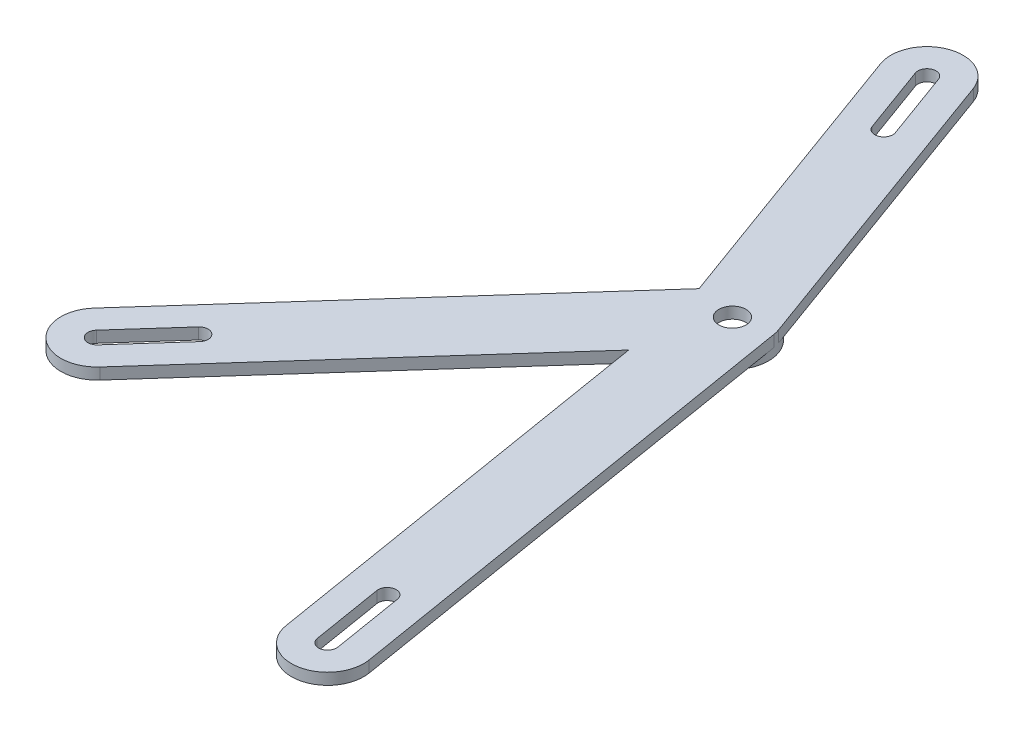
ISO-10303-21;
HEADER;
FILE_DESCRIPTION(('STEP AP214'),'2;1');
FILE_NAME('part.step','',(''),(''),'','','');
FILE_SCHEMA(('AUTOMOTIVE_DESIGN { 1 0 10303 214 1 1 1 1 }'));
ENDSEC;
DATA;
#1=APPLICATION_CONTEXT('core data for automotive mechanical design processes');
#2=APPLICATION_PROTOCOL_DEFINITION('international standard','automotive_design',2000,#1);
#3=PRODUCT_CONTEXT('',#1,'mechanical');
#4=PRODUCT('Part','Part','',(#3));
#5=PRODUCT_RELATED_PRODUCT_CATEGORY('part','',(#4));
#6=PRODUCT_DEFINITION_FORMATION('','',#4);
#7=PRODUCT_DEFINITION_CONTEXT('part definition',#1,'design');
#8=PRODUCT_DEFINITION('design','',#6,#7);
#9=PRODUCT_DEFINITION_SHAPE('','',#8);
#10=(LENGTH_UNIT() NAMED_UNIT(*) SI_UNIT(.MILLI.,.METRE.));
#11=(NAMED_UNIT(*) PLANE_ANGLE_UNIT() SI_UNIT($,.RADIAN.));
#12=(NAMED_UNIT(*) SI_UNIT($,.STERADIAN.) SOLID_ANGLE_UNIT());
#13=UNCERTAINTY_MEASURE_WITH_UNIT(LENGTH_MEASURE(1.E-05),#10,'distance_accuracy_value','');
#14=(GEOMETRIC_REPRESENTATION_CONTEXT(3) GLOBAL_UNCERTAINTY_ASSIGNED_CONTEXT((#13)) GLOBAL_UNIT_ASSIGNED_CONTEXT((#10,
#11,#12)) REPRESENTATION_CONTEXT('',''));
#15=CARTESIAN_POINT('',(0.,0.,0.));
#16=DIRECTION('',(0.,0.,1.));
#17=DIRECTION('',(1.,0.,0.));
#18=AXIS2_PLACEMENT_3D('',#15,#16,#17);
#19=CARTESIAN_POINT('',(-133.280183157734,-3.,164.123164888468));
#20=DIRECTION('',(0.,1.,0.));
#21=DIRECTION('',(0.,0.,1.));
#22=AXIS2_PLACEMENT_3D('',#19,#20,#21);
#23=CYLINDRICAL_SURFACE('',#22,3.175);
#24=DIRECTION('',(0.,1.,0.));
#25=VECTOR('',#24,1.);
#26=CARTESIAN_POINT('',(-135.646330605221,-3.,162.006098225193));
#27=LINE('',#26,#25);
#28=CARTESIAN_POINT('',(-135.646330605221,4.,162.006098225193));
#29=VERTEX_POINT('',#28);
#30=CARTESIAN_POINT('',(-135.646330605221,0.,162.006098225193));
#31=VERTEX_POINT('',#30);
#32=EDGE_CURVE('E383',#29,#31,#27,.F.);
#33=ORIENTED_EDGE('',*,*,#32,.F.);
#34=CARTESIAN_POINT('',(-133.280183157734,4.,164.123164888468));
#35=DIRECTION('',(0.,1.,0.));
#36=DIRECTION('',(0.,0.,1.));
#37=AXIS2_PLACEMENT_3D('',#34,#35,#36);
#38=CIRCLE('',#37,3.175);
#39=CARTESIAN_POINT('',(-130.914035710247,4.,166.240231551743));
#40=VERTEX_POINT('',#39);
#41=EDGE_CURVE('E235',#29,#40,#38,.T.);
#42=ORIENTED_EDGE('',*,*,#41,.T.);
#43=DIRECTION('',(0.,1.,0.));
#44=VECTOR('',#43,1.);
#45=CARTESIAN_POINT('',(-130.914035710247,-3.,166.240231551743));
#46=LINE('',#45,#44);
#47=CARTESIAN_POINT('',(-130.914035710247,0.,166.240231551743));
#48=VERTEX_POINT('',#47);
#49=EDGE_CURVE('E380',#40,#48,#46,.F.);
#50=ORIENTED_EDGE('',*,*,#49,.T.);
#51=CARTESIAN_POINT('',(-133.280183157734,0.,164.123164888468));
#52=DIRECTION('',(0.,1.,0.));
#53=DIRECTION('',(0.,0.,1.));
#54=AXIS2_PLACEMENT_3D('',#51,#52,#53);
#55=CIRCLE('',#54,3.175);
#56=EDGE_CURVE('E226',#31,#48,#55,.T.);
#57=ORIENTED_EDGE('',*,*,#56,.F.);
#58=EDGE_LOOP('',(#33,#42,#50,#57));
#59=FACE_BOUND('',#58,.T.);
#60=ADVANCED_FACE('F44',(#59),#23,.F.);
#61=CARTESIAN_POINT('',(0.159159837328364,-3.,216.518806919335));
#62=DIRECTION('',(0.,1.,0.));
#63=DIRECTION('',(0.,0.,1.));
#64=AXIS2_PLACEMENT_3D('',#61,#62,#63);
#65=CYLINDRICAL_SURFACE('',#64,3.175);
#66=DIRECTION('',(0.,1.,0.));
#67=VECTOR('',#66,1.);
#68=CARTESIAN_POINT('',(-2.97383797836201,-3.,217.033539555642));
#69=LINE('',#68,#67);
#70=CARTESIAN_POINT('',(-2.97383797836201,4.,217.033539555642));
#71=VERTEX_POINT('',#70);
#72=CARTESIAN_POINT('',(-2.97383797836201,0.,217.033539555642));
#73=VERTEX_POINT('',#72);
#74=EDGE_CURVE('E377',#71,#73,#69,.F.);
#75=ORIENTED_EDGE('',*,*,#74,.F.);
#76=CARTESIAN_POINT('',(0.159159837328364,4.,216.518806919335));
#77=DIRECTION('',(0.,1.,0.));
#78=DIRECTION('',(0.,0.,1.));
#79=AXIS2_PLACEMENT_3D('',#76,#77,#78);
#80=CIRCLE('',#79,3.175);
#81=CARTESIAN_POINT('',(3.29215765301874,4.,216.004074283028));
#82=VERTEX_POINT('',#81);
#83=EDGE_CURVE('E227',#71,#82,#80,.T.);
#84=ORIENTED_EDGE('',*,*,#83,.T.);
#85=DIRECTION('',(0.,1.,0.));
#86=VECTOR('',#85,1.);
#87=CARTESIAN_POINT('',(3.29215765301874,-3.,216.004074283028));
#88=LINE('',#87,#86);
#89=CARTESIAN_POINT('',(3.29215765301874,0.,216.004074283028));
#90=VERTEX_POINT('',#89);
#91=EDGE_CURVE('E374',#82,#90,#88,.F.);
#92=ORIENTED_EDGE('',*,*,#91,.T.);
#93=CARTESIAN_POINT('',(0.159159837328364,0.,216.518806919335));
#94=DIRECTION('',(0.,1.,0.));
#95=DIRECTION('',(0.,0.,1.));
#96=AXIS2_PLACEMENT_3D('',#93,#94,#95);
#97=CIRCLE('',#96,3.175);
#98=EDGE_CURVE('E232',#73,#90,#97,.T.);
#99=ORIENTED_EDGE('',*,*,#98,.F.);
#100=EDGE_LOOP('',(#75,#84,#92,#99));
#101=FACE_BOUND('',#100,.T.);
#102=ADVANCED_FACE('F485',(#101),#65,.F.);
#103=CARTESIAN_POINT('',(-67.0106447263582,-3.,-61.3225533952196));
#104=DIRECTION('',(0.,1.,0.));
#105=DIRECTION('',(0.,0.,1.));
#106=AXIS2_PLACEMENT_3D('',#103,#104,#105);
#107=CYLINDRICAL_SURFACE('',#106,3.175);
#108=DIRECTION('',(0.,1.,0.));
#109=VECTOR('',#108,1.);
#110=CARTESIAN_POINT('',(-64.0274998926001,-3.,-62.4095087304667));
#111=LINE('',#110,#109);
#112=CARTESIAN_POINT('',(-64.0274998926001,4.,-62.4095087304667));
#113=VERTEX_POINT('',#112);
#114=CARTESIAN_POINT('',(-64.0274998926001,0.,-62.4095087304667));
#115=VERTEX_POINT('',#114);
#116=EDGE_CURVE('E209',#113,#115,#111,.F.);
#117=ORIENTED_EDGE('',*,*,#116,.F.);
#118=CARTESIAN_POINT('',(-67.0106447263582,4.,-61.3225533952196));
#119=DIRECTION('',(0.,1.,0.));
#120=DIRECTION('',(0.,0.,1.));
#121=AXIS2_PLACEMENT_3D('',#118,#119,#120);
#122=CIRCLE('',#121,3.175);
#123=CARTESIAN_POINT('',(-69.9937895601164,4.,-60.2355980599725));
#124=VERTEX_POINT('',#123);
#125=EDGE_CURVE('E217',#113,#124,#122,.T.);
#126=ORIENTED_EDGE('',*,*,#125,.T.);
#127=DIRECTION('',(0.,1.,0.));
#128=VECTOR('',#127,1.);
#129=CARTESIAN_POINT('',(-69.9937895601164,-3.,-60.2355980599725));
#130=LINE('',#129,#128);
#131=CARTESIAN_POINT('',(-69.9937895601164,0.,-60.2355980599725));
#132=VERTEX_POINT('',#131);
#133=EDGE_CURVE('E196',#124,#132,#130,.F.);
#134=ORIENTED_EDGE('',*,*,#133,.T.);
#135=CARTESIAN_POINT('',(-67.0106447263582,0.,-61.3225533952196));
#136=DIRECTION('',(0.,1.,0.));
#137=DIRECTION('',(0.,0.,1.));
#138=AXIS2_PLACEMENT_3D('',#135,#136,#137);
#139=CIRCLE('',#138,3.175);
#140=EDGE_CURVE('E253',#115,#132,#139,.T.);
#141=ORIENTED_EDGE('',*,*,#140,.F.);
#142=EDGE_LOOP('',(#117,#126,#134,#141));
#143=FACE_BOUND('',#142,.T.);
#144=ADVANCED_FACE('F224',(#143),#107,.F.);
#145=CARTESIAN_POINT('',(-27.8150353373511,-3.,46.2496493100997));
#146=DIRECTION('',(0.,1.,0.));
#147=DIRECTION('',(0.,0.,1.));
#148=AXIS2_PLACEMENT_3D('',#145,#146,#147);
#149=CYLINDRICAL_SURFACE('',#148,4.7625);
#150=CARTESIAN_POINT('',(-27.8150353373511,4.,46.2496493100997));
#151=DIRECTION('',(0.,1.,0.));
#152=DIRECTION('',(0.,0.,1.));
#153=AXIS2_PLACEMENT_3D('',#150,#151,#152);
#154=CIRCLE('',#153,4.7625);
#155=CARTESIAN_POINT('',(-27.8150353373511,4.,51.0121493100997));
#156=VERTEX_POINT('',#155);
#157=EDGE_CURVE('E254',#156,#156,#154,.T.);
#158=ORIENTED_EDGE('',*,*,#157,.T.);
#159=EDGE_LOOP('',(#158));
#160=FACE_BOUND('',#159,.T.);
#161=CARTESIAN_POINT('',(-27.8150353373511,0.,46.2496493100997));
#162=DIRECTION('',(0.,-1.,0.));
#163=DIRECTION('',(0.,0.,-1.));
#164=AXIS2_PLACEMENT_3D('',#161,#162,#163);
#165=CIRCLE('',#164,4.7625);
#166=CARTESIAN_POINT('',(-27.8150353373511,0.,41.4871493100997));
#167=VERTEX_POINT('',#166);
#168=EDGE_CURVE('E248',#167,#167,#165,.F.);
#169=ORIENTED_EDGE('',*,*,#168,.F.);
#170=EDGE_LOOP('',(#169));
#171=FACE_BOUND('',#170,.T.);
#172=ADVANCED_FACE('F492',(#160,#171),#149,.F.);
#173=CARTESIAN_POINT('',(-67.0106447263582,4.,-61.3225533952196));
#174=DIRECTION('',(0.,-1.,0.));
#175=DIRECTION('',(0.,0.,-1.));
#176=AXIS2_PLACEMENT_3D('',#173,#174,#175);
#177=CYLINDRICAL_SURFACE('',#176,12.7);
#178=CARTESIAN_POINT('',(-67.0106447263582,0.,-61.3225533952196));
#179=DIRECTION('',(0.,1.,0.));
#180=DIRECTION('',(0.,0.,1.));
#181=AXIS2_PLACEMENT_3D('',#178,#179,#180);
#182=CIRCLE('',#181,12.7);
#183=CARTESIAN_POINT('',(-55.0780653913257,0.,-65.6703747362081));
#184=VERTEX_POINT('',#183);
#185=CARTESIAN_POINT('',(-78.9432240613906,0.,-56.9747320542308));
#186=VERTEX_POINT('',#185);
#187=EDGE_CURVE('E262',#184,#186,#182,.T.);
#188=ORIENTED_EDGE('',*,*,#187,.T.);
#189=DIRECTION('',(0.,-1.,0.));
#190=VECTOR('',#189,1.);
#191=CARTESIAN_POINT('',(-78.9432240613906,4.,-56.9747320542308));
#192=LINE('',#191,#190);
#193=CARTESIAN_POINT('',(-78.9432240613906,4.,-56.9747320542308));
#194=VERTEX_POINT('',#193);
#195=EDGE_CURVE('E358',#194,#186,#192,.T.);
#196=ORIENTED_EDGE('',*,*,#195,.F.);
#197=CARTESIAN_POINT('',(-67.0106447263582,4.,-61.3225533952196));
#198=DIRECTION('',(0.,1.,0.));
#199=DIRECTION('',(0.,0.,1.));
#200=AXIS2_PLACEMENT_3D('',#197,#198,#199);
#201=CIRCLE('',#200,12.7);
#202=CARTESIAN_POINT('',(-55.0780653913257,4.,-65.6703747362081));
#203=VERTEX_POINT('',#202);
#204=EDGE_CURVE('E263',#203,#194,#201,.T.);
#205=ORIENTED_EDGE('',*,*,#204,.F.);
#206=DIRECTION('',(0.,-1.,0.));
#207=VECTOR('',#206,1.);
#208=CARTESIAN_POINT('',(-55.0780653913257,4.,-65.6703747362081));
#209=LINE('',#208,#207);
#210=EDGE_CURVE('E295',#203,#184,#209,.T.);
#211=ORIENTED_EDGE('',*,*,#210,.T.);
#212=EDGE_LOOP('',(#188,#196,#205,#211));
#213=FACE_BOUND('',#212,.T.);
#214=ADVANCED_FACE('F46',(#213),#177,.T.);
#215=CARTESIAN_POINT('',(-78.9432240613906,4.,-56.9747320542308));
#216=DIRECTION('',(0.939573175986812,0.,-0.342348137085708));
#217=DIRECTION('',(-0.342348137085708,0.,-0.939573175986812));
#218=AXIS2_PLACEMENT_3D('',#215,#216,#217);
#219=PLANE('',#218);
#220=DIRECTION('',(0.342348137085708,0.,0.939573175986812));
#221=VECTOR('',#220,1.);
#222=CARTESIAN_POINT('',(-78.9432240613906,0.,-56.9747320542308));
#223=LINE('',#222,#221);
#224=CARTESIAN_POINT('',(-42.3517937842619,0.,43.4503108627536));
#225=VERTEX_POINT('',#224);
#226=EDGE_CURVE('E299',#186,#225,#223,.T.);
#227=ORIENTED_EDGE('',*,*,#226,.T.);
#228=DIRECTION('',(0.,-1.,0.));
#229=VECTOR('',#228,1.);
#230=CARTESIAN_POINT('',(-42.3517937842619,4.,43.4503108627536));
#231=LINE('',#230,#229);
#232=CARTESIAN_POINT('',(-42.3517937842619,4.,43.4503108627536));
#233=VERTEX_POINT('',#232);
#234=EDGE_CURVE('E354',#233,#225,#231,.T.);
#235=ORIENTED_EDGE('',*,*,#234,.F.);
#236=DIRECTION('',(0.342348137085708,0.,0.939573175986812));
#237=VECTOR('',#236,1.);
#238=CARTESIAN_POINT('',(-78.9432240613906,4.,-56.9747320542308));
#239=LINE('',#238,#237);
#240=EDGE_CURVE('E267',#194,#233,#239,.T.);
#241=ORIENTED_EDGE('',*,*,#240,.F.);
#242=ORIENTED_EDGE('',*,*,#195,.T.);
#243=EDGE_LOOP('',(#227,#235,#241,#242));
#244=FACE_BOUND('',#243,.T.);
#245=ADVANCED_FACE('F544',(#244),#219,.F.);
#246=CARTESIAN_POINT('',(-42.3517937842619,4.,43.4503108627536));
#247=DIRECTION('',(0.745243290547027,0.,0.666792649850491));
#248=DIRECTION('',(0.666792649850491,0.,-0.745243290547027));
#249=AXIS2_PLACEMENT_3D('',#246,#247,#248);
#250=PLANE('',#249);
#251=DIRECTION('',(-0.666792649850491,0.,0.745243290547027));
#252=VECTOR('',#251,1.);
#253=CARTESIAN_POINT('',(-42.3517937842619,0.,43.4503108627536));
#254=LINE('',#253,#252);
#255=CARTESIAN_POINT('',(-142.744772947681,0.,155.654898235367));
#256=VERTEX_POINT('',#255);
#257=EDGE_CURVE('E302',#225,#256,#254,.T.);
#258=ORIENTED_EDGE('',*,*,#257,.T.);
#259=DIRECTION('',(0.,-1.,0.));
#260=VECTOR('',#259,1.);
#261=CARTESIAN_POINT('',(-142.744772947681,4.,155.654898235367));
#262=LINE('',#261,#260);
#263=CARTESIAN_POINT('',(-142.744772947681,4.,155.654898235367));
#264=VERTEX_POINT('',#263);
#265=EDGE_CURVE('E350',#264,#256,#262,.T.);
#266=ORIENTED_EDGE('',*,*,#265,.F.);
#267=DIRECTION('',(-0.666792649850491,0.,0.745243290547027));
#268=VECTOR('',#267,1.);
#269=CARTESIAN_POINT('',(-42.3517937842619,4.,43.4503108627536));
#270=LINE('',#269,#268);
#271=EDGE_CURVE('E271',#233,#264,#270,.T.);
#272=ORIENTED_EDGE('',*,*,#271,.F.);
#273=ORIENTED_EDGE('',*,*,#234,.T.);
#274=EDGE_LOOP('',(#258,#266,#272,#273));
#275=FACE_BOUND('',#274,.T.);
#276=ADVANCED_FACE('F541',(#275),#250,.F.);
#277=CARTESIAN_POINT('',(-133.280183157734,4.,164.123164888468));
#278=DIRECTION('',(0.,-1.,0.));
#279=DIRECTION('',(0.,0.,-1.));
#280=AXIS2_PLACEMENT_3D('',#277,#278,#279);
#281=CYLINDRICAL_SURFACE('',#280,12.7);
#282=CARTESIAN_POINT('',(-133.280183157734,0.,164.123164888468));
#283=DIRECTION('',(0.,1.,0.));
#284=DIRECTION('',(0.,0.,1.));
#285=AXIS2_PLACEMENT_3D('',#282,#283,#284);
#286=CIRCLE('',#285,12.7);
#287=CARTESIAN_POINT('',(-123.815593367787,0.,172.591431541569));
#288=VERTEX_POINT('',#287);
#289=EDGE_CURVE('E305',#256,#288,#286,.T.);
#290=ORIENTED_EDGE('',*,*,#289,.T.);
#291=DIRECTION('',(0.,-1.,0.));
#292=VECTOR('',#291,1.);
#293=CARTESIAN_POINT('',(-123.815593367787,4.,172.591431541569));
#294=LINE('',#293,#292);
#295=CARTESIAN_POINT('',(-123.815593367787,4.,172.591431541569));
#296=VERTEX_POINT('',#295);
#297=EDGE_CURVE('E346',#296,#288,#294,.T.);
#298=ORIENTED_EDGE('',*,*,#297,.F.);
#299=CARTESIAN_POINT('',(-133.280183157734,4.,164.123164888468));
#300=DIRECTION('',(0.,1.,0.));
#301=DIRECTION('',(0.,0.,1.));
#302=AXIS2_PLACEMENT_3D('',#299,#300,#301);
#303=CIRCLE('',#302,12.7);
#304=EDGE_CURVE('E274',#264,#296,#303,.T.);
#305=ORIENTED_EDGE('',*,*,#304,.F.);
#306=ORIENTED_EDGE('',*,*,#265,.T.);
#307=EDGE_LOOP('',(#290,#298,#305,#306));
#308=FACE_BOUND('',#307,.T.);
#309=ADVANCED_FACE('F537',(#308),#281,.T.);
#310=CARTESIAN_POINT('',(-36.0448907355709,4.,74.4941785830614));
#311=DIRECTION('',(-0.745243290547029,0.,-0.666792649850489));
#312=DIRECTION('',(-0.666792649850489,0.,0.745243290547029));
#313=AXIS2_PLACEMENT_3D('',#310,#311,#312);
#314=PLANE('',#313);
#315=DIRECTION('',(0.666792649850489,0.,-0.745243290547029));
#316=VECTOR('',#315,1.);
#317=CARTESIAN_POINT('',(-36.0448907355709,0.,74.4941785830614));
#318=LINE('',#317,#316);
#319=CARTESIAN_POINT('',(-36.0448907355709,0.,74.4941785830614));
#320=VERTEX_POINT('',#319);
#321=EDGE_CURVE('E308',#288,#320,#318,.T.);
#322=ORIENTED_EDGE('',*,*,#321,.T.);
#323=DIRECTION('',(0.,-1.,0.));
#324=VECTOR('',#323,1.);
#325=CARTESIAN_POINT('',(-36.0448907355709,4.,74.4941785830614));
#326=LINE('',#325,#324);
#327=CARTESIAN_POINT('',(-36.0448907355709,4.,74.4941785830614));
#328=VERTEX_POINT('',#327);
#329=EDGE_CURVE('E342',#328,#320,#326,.T.);
#330=ORIENTED_EDGE('',*,*,#329,.F.);
#331=DIRECTION('',(0.666792649850489,0.,-0.745243290547029));
#332=VECTOR('',#331,1.);
#333=CARTESIAN_POINT('',(-36.0448907355709,4.,74.4941785830614));
#334=LINE('',#333,#332);
#335=EDGE_CURVE('E277',#296,#328,#334,.T.);
#336=ORIENTED_EDGE('',*,*,#335,.F.);
#337=ORIENTED_EDGE('',*,*,#297,.T.);
#338=EDGE_LOOP('',(#322,#330,#336,#337));
#339=FACE_BOUND('',#338,.T.);
#340=ADVANCED_FACE('F533',(#339),#314,.F.);
#341=CARTESIAN_POINT('',(-36.0448907355709,4.,74.4941785830614));
#342=DIRECTION('',(0.986770965571771,0.,-0.162120515372221));
#343=DIRECTION('',(-0.162120515372221,0.,-0.986770965571771));
#344=AXIS2_PLACEMENT_3D('',#341,#342,#343);
#345=PLANE('',#344);
#346=DIRECTION('',(0.162120515372221,0.,0.986770965571771));
#347=VECTOR('',#346,1.);
#348=CARTESIAN_POINT('',(-36.0448907355709,0.,74.4941785830614));
#349=LINE('',#348,#347);
#350=CARTESIAN_POINT('',(-12.3728314254372,0.,218.577737464563));
#351=VERTEX_POINT('',#350);
#352=EDGE_CURVE('E311',#320,#351,#349,.T.);
#353=ORIENTED_EDGE('',*,*,#352,.T.);
#354=DIRECTION('',(0.,-1.,0.));
#355=VECTOR('',#354,1.);
#356=CARTESIAN_POINT('',(-12.3728314254372,4.,218.577737464563));
#357=LINE('',#356,#355);
#358=CARTESIAN_POINT('',(-12.3728314254372,4.,218.577737464563));
#359=VERTEX_POINT('',#358);
#360=EDGE_CURVE('E338',#359,#351,#357,.T.);
#361=ORIENTED_EDGE('',*,*,#360,.F.);
#362=DIRECTION('',(0.162120515372221,0.,0.986770965571771));
#363=VECTOR('',#362,1.);
#364=CARTESIAN_POINT('',(-36.0448907355709,4.,74.4941785830614));
#365=LINE('',#364,#363);
#366=EDGE_CURVE('E280',#328,#359,#365,.T.);
#367=ORIENTED_EDGE('',*,*,#366,.F.);
#368=ORIENTED_EDGE('',*,*,#329,.T.);
#369=EDGE_LOOP('',(#353,#361,#367,#368));
#370=FACE_BOUND('',#369,.T.);
#371=ADVANCED_FACE('F529',(#370),#345,.F.);
#372=CARTESIAN_POINT('',(0.159159837328364,4.,216.518806919335));
#373=DIRECTION('',(0.,-1.,0.));
#374=DIRECTION('',(0.,0.,-1.));
#375=AXIS2_PLACEMENT_3D('',#372,#373,#374);
#376=CYLINDRICAL_SURFACE('',#375,12.7000000000041);
#377=CARTESIAN_POINT('',(0.159159837328364,0.,216.518806919335));
#378=DIRECTION('',(0.,1.,0.));
#379=DIRECTION('',(0.,0.,1.));
#380=AXIS2_PLACEMENT_3D('',#377,#378,#379);
#381=CIRCLE('',#380,12.7000000000041);
#382=CARTESIAN_POINT('',(12.6911511000939,0.,214.459876374107));
#383=VERTEX_POINT('',#382);
#384=EDGE_CURVE('E314',#351,#383,#381,.T.);
#385=ORIENTED_EDGE('',*,*,#384,.T.);
#386=DIRECTION('',(0.,-1.,0.));
#387=VECTOR('',#386,1.);
#388=CARTESIAN_POINT('',(12.6911511000939,4.,214.459876374107));
#389=LINE('',#388,#387);
#390=CARTESIAN_POINT('',(12.6911511000939,4.,214.459876374107));
#391=VERTEX_POINT('',#390);
#392=EDGE_CURVE('E334',#391,#383,#389,.T.);
#393=ORIENTED_EDGE('',*,*,#392,.F.);
#394=CARTESIAN_POINT('',(0.159159837328364,4.,216.518806919335));
#395=DIRECTION('',(0.,1.,0.));
#396=DIRECTION('',(0.,0.,1.));
#397=AXIS2_PLACEMENT_3D('',#394,#395,#396);
#398=CIRCLE('',#397,12.7000000000041);
#399=EDGE_CURVE('E283',#359,#391,#398,.T.);
#400=ORIENTED_EDGE('',*,*,#399,.F.);
#401=ORIENTED_EDGE('',*,*,#360,.T.);
#402=EDGE_LOOP('',(#385,#393,#400,#401));
#403=FACE_BOUND('',#402,.T.);
#404=ADVANCED_FACE('F525',(#403),#376,.T.);
#405=CARTESIAN_POINT('',(-15.2830440745856,4.,44.1907187648711));
#406=DIRECTION('',(-0.986770965571763,0.,0.162120515372269));
#407=DIRECTION('',(0.162120515372269,0.,0.986770965571763));
#408=AXIS2_PLACEMENT_3D('',#405,#406,#407);
#409=PLANE('',#408);
#410=DIRECTION('',(-0.162120515372269,0.,-0.986770965571763));
#411=VECTOR('',#410,1.);
#412=CARTESIAN_POINT('',(-15.2830440745856,0.,44.1907187648711));
#413=LINE('',#412,#411);
#414=CARTESIAN_POINT('',(-15.2830440745856,0.,44.1907187648711));
#415=VERTEX_POINT('',#414);
#416=EDGE_CURVE('E317',#383,#415,#413,.T.);
#417=ORIENTED_EDGE('',*,*,#416,.T.);
#418=DIRECTION('',(0.,-1.,0.));
#419=VECTOR('',#418,1.);
#420=CARTESIAN_POINT('',(-15.2830440745856,4.,44.1907187648711));
#421=LINE('',#420,#419);
#422=CARTESIAN_POINT('',(-15.2830440745856,4.,44.1907187648711));
#423=VERTEX_POINT('',#422);
#424=EDGE_CURVE('E330',#423,#415,#421,.T.);
#425=ORIENTED_EDGE('',*,*,#424,.F.);
#426=DIRECTION('',(-0.162120515372269,0.,-0.986770965571763));
#427=VECTOR('',#426,1.);
#428=CARTESIAN_POINT('',(-15.2830440745856,4.,44.1907187648711));
#429=LINE('',#428,#427);
#430=EDGE_CURVE('E286',#391,#423,#429,.T.);
#431=ORIENTED_EDGE('',*,*,#430,.F.);
#432=ORIENTED_EDGE('',*,*,#392,.T.);
#433=EDGE_LOOP('',(#417,#425,#431,#432));
#434=FACE_BOUND('',#433,.T.);
#435=ADVANCED_FACE('F521',(#434),#409,.F.);
#436=CARTESIAN_POINT('',(-27.8150353373511,4.,46.2496493100997));
#437=DIRECTION('',(0.,-1.,0.));
#438=DIRECTION('',(0.,0.,-1.));
#439=AXIS2_PLACEMENT_3D('',#436,#437,#438);
#440=CYLINDRICAL_SURFACE('',#439,12.7000000000042);
#441=ORIENTED_EDGE('',*,*,#424,.T.);
#442=CARTESIAN_POINT('',(-27.8150353373511,0.,46.2496493100997));
#443=DIRECTION('',(0.,1.,0.));
#444=DIRECTION('',(0.,0.,1.));
#445=AXIS2_PLACEMENT_3D('',#442,#443,#444);
#446=CIRCLE('',#445,12.7000000000042);
#447=CARTESIAN_POINT('',(-15.8824560023146,0.,41.9018279691098));
#448=VERTEX_POINT('',#447);
#449=EDGE_CURVE('E210',#448,#415,#446,.T.);
#450=ORIENTED_EDGE('',*,*,#449,.F.);
#451=DIRECTION('',(0.,-1.,0.));
#452=VECTOR('',#451,1.);
#453=CARTESIAN_POINT('',(-15.8824560023146,4.,41.9018279691098));
#454=LINE('',#453,#452);
#455=CARTESIAN_POINT('',(-15.8824560023146,4.,41.9018279691098));
#456=VERTEX_POINT('',#455);
#457=EDGE_CURVE('E326',#456,#448,#454,.T.);
#458=ORIENTED_EDGE('',*,*,#457,.F.);
#459=CARTESIAN_POINT('',(-27.8150353373511,4.,46.2496493100997));
#460=DIRECTION('',(0.,1.,0.));
#461=DIRECTION('',(0.,0.,-1.));
#462=AXIS2_PLACEMENT_3D('',#459,#460,#461);
#463=CIRCLE('',#462,12.7000000000042);
#464=EDGE_CURVE('E289',#423,#456,#463,.T.);
#465=ORIENTED_EDGE('',*,*,#464,.F.);
#466=EDGE_LOOP('',(#441,#450,#458,#465));
#467=FACE_BOUND('',#466,.T.);
#468=CARTESIAN_POINT('',(-27.8150353373511,-3.,46.2496493100997));
#469=DIRECTION('',(0.,1.,0.));
#470=DIRECTION('',(0.,0.,1.));
#471=AXIS2_PLACEMENT_3D('',#468,#469,#470);
#472=CIRCLE('',#471,12.7000000000042);
#473=CARTESIAN_POINT('',(-27.8150353373511,-3.,58.9496493101039));
#474=VERTEX_POINT('',#473);
#475=EDGE_CURVE('E258',#474,#474,#472,.T.);
#476=ORIENTED_EDGE('',*,*,#475,.T.);
#477=EDGE_LOOP('',(#476));
#478=FACE_BOUND('',#477,.T.);
#479=ADVANCED_FACE('F517',(#467,#478),#440,.T.);
#480=CARTESIAN_POINT('',(-55.0780653913257,4.,-65.6703747362081));
#481=DIRECTION('',(-0.939573175986813,0.,0.342348137085707));
#482=DIRECTION('',(0.342348137085707,0.,0.939573175986813));
#483=AXIS2_PLACEMENT_3D('',#480,#481,#482);
#484=PLANE('',#483);
#485=DIRECTION('',(-0.342348137085707,0.,-0.939573175986813));
#486=VECTOR('',#485,1.);
#487=CARTESIAN_POINT('',(-55.0780653913257,0.,-65.6703747362081));
#488=LINE('',#487,#486);
#489=EDGE_CURVE('E268',#448,#184,#488,.T.);
#490=ORIENTED_EDGE('',*,*,#489,.T.);
#491=ORIENTED_EDGE('',*,*,#210,.F.);
#492=DIRECTION('',(-0.342348137085707,0.,-0.939573175986813));
#493=VECTOR('',#492,1.);
#494=CARTESIAN_POINT('',(-55.0780653913257,4.,-65.6703747362081));
#495=LINE('',#494,#493);
#496=EDGE_CURVE('E292',#456,#203,#495,.T.);
#497=ORIENTED_EDGE('',*,*,#496,.F.);
#498=ORIENTED_EDGE('',*,*,#457,.T.);
#499=EDGE_LOOP('',(#490,#491,#497,#498));
#500=FACE_BOUND('',#499,.T.);
#501=ADVANCED_FACE('F513',(#500),#484,.F.);
#502=CARTESIAN_POINT('',(-67.0106447263582,4.,-61.3225533952196));
#503=DIRECTION('',(0.,1.,0.));
#504=DIRECTION('',(0.,0.,1.));
#505=AXIS2_PLACEMENT_3D('',#502,#503,#504);
#506=PLANE('',#505);
#507=DIRECTION('',(-0.342348137085708,0.,-0.939573175986812));
#508=VECTOR('',#507,1.);
#509=CARTESIAN_POINT('',(-64.0274998926001,4.,-62.4095087304667));
#510=LINE('',#509,#508);
#511=CARTESIAN_POINT('',(-55.3318572106231,4.,-38.5443500604017));
#512=VERTEX_POINT('',#511);
#513=EDGE_CURVE('E456',#512,#113,#510,.T.);
#514=ORIENTED_EDGE('',*,*,#513,.F.);
#515=CARTESIAN_POINT('',(-58.3150020443813,4.,-37.4573947251546));
#516=DIRECTION('',(0.,1.,0.));
#517=DIRECTION('',(0.,0.,1.));
#518=AXIS2_PLACEMENT_3D('',#515,#516,#517);
#519=CIRCLE('',#518,3.175);
#520=CARTESIAN_POINT('',(-61.2981468781394,4.,-36.3704393899074));
#521=VERTEX_POINT('',#520);
#522=EDGE_CURVE('E219',#521,#512,#519,.T.);
#523=ORIENTED_EDGE('',*,*,#522,.F.);
#524=DIRECTION('',(0.342348137085708,0.,0.939573175986812));
#525=VECTOR('',#524,1.);
#526=CARTESIAN_POINT('',(-69.9937895601164,4.,-60.2355980599725));
#527=LINE('',#526,#525);
#528=EDGE_CURVE('E200',#124,#521,#527,.T.);
#529=ORIENTED_EDGE('',*,*,#528,.F.);
#530=ORIENTED_EDGE('',*,*,#125,.F.);
#531=EDGE_LOOP('',(#514,#523,#529,#530));
#532=FACE_BOUND('',#531,.T.);
#533=DIRECTION('',(-0.666792649850489,0.,0.745243290547029));
#534=VECTOR('',#533,1.);
#535=CARTESIAN_POINT('',(-135.646330605221,4.,162.006098225193));
#536=LINE('',#535,#534);
#537=CARTESIAN_POINT('',(-118.709797299018,4.,143.076918645298));
#538=VERTEX_POINT('',#537);
#539=EDGE_CURVE('E407',#538,#29,#536,.T.);
#540=ORIENTED_EDGE('',*,*,#539,.F.);
#541=CARTESIAN_POINT('',(-116.343649851532,4.,145.193985308574));
#542=DIRECTION('',(0.,1.,0.));
#543=DIRECTION('',(0.,0.,1.));
#544=AXIS2_PLACEMENT_3D('',#541,#542,#543);
#545=CIRCLE('',#544,3.17500000000002);
#546=CARTESIAN_POINT('',(-113.977502404045,4.,147.311051971849));
#547=VERTEX_POINT('',#546);
#548=EDGE_CURVE('E411',#547,#538,#545,.T.);
#549=ORIENTED_EDGE('',*,*,#548,.F.);
#550=DIRECTION('',(0.66679264985049,0.,-0.745243290547028));
#551=VECTOR('',#550,1.);
#552=CARTESIAN_POINT('',(-130.914035710247,4.,166.240231551743));
#553=LINE('',#552,#551);
#554=EDGE_CURVE('E221',#40,#547,#553,.T.);
#555=ORIENTED_EDGE('',*,*,#554,.F.);
#556=ORIENTED_EDGE('',*,*,#41,.F.);
#557=EDGE_LOOP('',(#540,#549,#555,#556));
#558=FACE_BOUND('',#557,.T.);
#559=DIRECTION('',(0.162120515372221,0.,0.986770965571771));
#560=VECTOR('',#559,1.);
#561=CARTESIAN_POINT('',(-2.97383797836201,4.,217.033539555642));
#562=LINE('',#561,#560);
#563=CARTESIAN_POINT('',(-7.09169906881644,4.,191.969557030119));
#564=VERTEX_POINT('',#563);
#565=EDGE_CURVE('E426',#564,#71,#562,.T.);
#566=ORIENTED_EDGE('',*,*,#565,.F.);
#567=CARTESIAN_POINT('',(-3.95870125312606,4.,191.454824393812));
#568=DIRECTION('',(0.,1.,0.));
#569=DIRECTION('',(0.,0.,1.));
#570=AXIS2_PLACEMENT_3D('',#567,#568,#569);
#571=CIRCLE('',#570,3.175);
#572=CARTESIAN_POINT('',(-0.825703437435691,4.,190.940091757505));
#573=VERTEX_POINT('',#572);
#574=EDGE_CURVE('E432',#573,#564,#571,.T.);
#575=ORIENTED_EDGE('',*,*,#574,.F.);
#576=DIRECTION('',(-0.162120515372221,0.,-0.986770965571771));
#577=VECTOR('',#576,1.);
#578=CARTESIAN_POINT('',(3.29215765301874,4.,216.004074283028));
#579=LINE('',#578,#577);
#580=EDGE_CURVE('E413',#82,#573,#579,.T.);
#581=ORIENTED_EDGE('',*,*,#580,.F.);
#582=ORIENTED_EDGE('',*,*,#83,.F.);
#583=EDGE_LOOP('',(#566,#575,#581,#582));
#584=FACE_BOUND('',#583,.T.);
#585=ORIENTED_EDGE('',*,*,#157,.F.);
#586=EDGE_LOOP('',(#585));
#587=FACE_BOUND('',#586,.T.);
#588=ORIENTED_EDGE('',*,*,#430,.T.);
#589=ORIENTED_EDGE('',*,*,#464,.T.);
#590=ORIENTED_EDGE('',*,*,#496,.T.);
#591=ORIENTED_EDGE('',*,*,#204,.T.);
#592=ORIENTED_EDGE('',*,*,#240,.T.);
#593=ORIENTED_EDGE('',*,*,#271,.T.);
#594=ORIENTED_EDGE('',*,*,#304,.T.);
#595=ORIENTED_EDGE('',*,*,#335,.T.);
#596=ORIENTED_EDGE('',*,*,#366,.T.);
#597=ORIENTED_EDGE('',*,*,#399,.T.);
#598=EDGE_LOOP('',(#588,#589,#590,#591,#592,#593,#594,#595,#596,#597));
#599=FACE_BOUND('',#598,.T.);
#600=ADVANCED_FACE('F215',(#532,#558,#584,#587,#599),#506,.T.);
#601=CARTESIAN_POINT('',(-67.0106447263582,0.,-61.3225533952196));
#602=DIRECTION('',(0.,1.,0.));
#603=DIRECTION('',(0.,0.,1.));
#604=AXIS2_PLACEMENT_3D('',#601,#602,#603);
#605=PLANE('',#604);
#606=CARTESIAN_POINT('',(-58.3150020443813,0.,-37.4573947251546));
#607=DIRECTION('',(0.,1.,0.));
#608=DIRECTION('',(0.,0.,1.));
#609=AXIS2_PLACEMENT_3D('',#606,#607,#608);
#610=CIRCLE('',#609,3.175);
#611=CARTESIAN_POINT('',(-61.2981468781394,0.,-36.3704393899074));
#612=VERTEX_POINT('',#611);
#613=CARTESIAN_POINT('',(-55.3318572106231,0.,-38.5443500604017));
#614=VERTEX_POINT('',#613);
#615=EDGE_CURVE('E11',#612,#614,#610,.T.);
#616=ORIENTED_EDGE('',*,*,#615,.T.);
#617=DIRECTION('',(-0.342348137085708,0.,-0.939573175986812));
#618=VECTOR('',#617,1.);
#619=CARTESIAN_POINT('',(-64.0274998926001,0.,-62.4095087304667));
#620=LINE('',#619,#618);
#621=EDGE_CURVE('E441',#614,#115,#620,.T.);
#622=ORIENTED_EDGE('',*,*,#621,.T.);
#623=ORIENTED_EDGE('',*,*,#140,.T.);
#624=DIRECTION('',(0.342348137085708,0.,0.939573175986813));
#625=VECTOR('',#624,1.);
#626=CARTESIAN_POINT('',(-69.9937895601164,0.,-60.2355980599725));
#627=LINE('',#626,#625);
#628=EDGE_CURVE('E203',#132,#612,#627,.T.);
#629=ORIENTED_EDGE('',*,*,#628,.T.);
#630=EDGE_LOOP('',(#616,#622,#623,#629));
#631=FACE_BOUND('',#630,.T.);
#632=CARTESIAN_POINT('',(-3.95870125312606,0.,191.454824393812));
#633=DIRECTION('',(0.,1.,0.));
#634=DIRECTION('',(0.,0.,1.));
#635=AXIS2_PLACEMENT_3D('',#632,#633,#634);
#636=CIRCLE('',#635,3.175);
#637=CARTESIAN_POINT('',(-0.825703437435691,0.,190.940091757505));
#638=VERTEX_POINT('',#637);
#639=CARTESIAN_POINT('',(-7.09169906881644,0.,191.969557030119));
#640=VERTEX_POINT('',#639);
#641=EDGE_CURVE('E386',#638,#640,#636,.T.);
#642=ORIENTED_EDGE('',*,*,#641,.T.);
#643=DIRECTION('',(0.162120515372222,0.,0.986770965571771));
#644=VECTOR('',#643,1.);
#645=CARTESIAN_POINT('',(-49.187164832602,0.,-64.2508435931663));
#646=LINE('',#645,#644);
#647=EDGE_CURVE('E448',#640,#73,#646,.T.);
#648=ORIENTED_EDGE('',*,*,#647,.T.);
#649=ORIENTED_EDGE('',*,*,#98,.T.);
#650=DIRECTION('',(-0.162120515372221,0.,-0.986770965571771));
#651=VECTOR('',#650,1.);
#652=CARTESIAN_POINT('',(-42.9211692012212,0.,-65.2803088657799));
#653=LINE('',#652,#651);
#654=EDGE_CURVE('E68',#90,#638,#653,.T.);
#655=ORIENTED_EDGE('',*,*,#654,.T.);
#656=EDGE_LOOP('',(#642,#648,#649,#655));
#657=FACE_BOUND('',#656,.T.);
#658=CARTESIAN_POINT('',(-116.343649851532,0.,145.193985308574));
#659=DIRECTION('',(0.,1.,0.));
#660=DIRECTION('',(0.,0.,1.));
#661=AXIS2_PLACEMENT_3D('',#658,#659,#660);
#662=CIRCLE('',#661,3.17500000000002);
#663=CARTESIAN_POINT('',(-113.977502404045,0.,147.311051971849));
#664=VERTEX_POINT('',#663);
#665=CARTESIAN_POINT('',(-118.709797299018,0.,143.076918645298));
#666=VERTEX_POINT('',#665);
#667=EDGE_CURVE('E53',#664,#666,#662,.T.);
#668=ORIENTED_EDGE('',*,*,#667,.T.);
#669=DIRECTION('',(-0.666792649850489,0.,0.745243290547029));
#670=VECTOR('',#669,1.);
#671=CARTESIAN_POINT('',(5.84703639909563,0.,3.86550918222889));
#672=LINE('',#671,#670);
#673=EDGE_CURVE('E238',#666,#31,#672,.T.);
#674=ORIENTED_EDGE('',*,*,#673,.T.);
#675=ORIENTED_EDGE('',*,*,#56,.T.);
#676=DIRECTION('',(0.666792649850491,0.,-0.745243290547028));
#677=VECTOR('',#676,1.);
#678=CARTESIAN_POINT('',(10.5793312940694,0.,8.09964250877993));
#679=LINE('',#678,#677);
#680=EDGE_CURVE('E60',#48,#664,#679,.T.);
#681=ORIENTED_EDGE('',*,*,#680,.T.);
#682=EDGE_LOOP('',(#668,#674,#675,#681));
#683=FACE_BOUND('',#682,.T.);
#684=ORIENTED_EDGE('',*,*,#489,.F.);
#685=ORIENTED_EDGE('',*,*,#449,.T.);
#686=ORIENTED_EDGE('',*,*,#416,.F.);
#687=ORIENTED_EDGE('',*,*,#384,.F.);
#688=ORIENTED_EDGE('',*,*,#352,.F.);
#689=ORIENTED_EDGE('',*,*,#321,.F.);
#690=ORIENTED_EDGE('',*,*,#289,.F.);
#691=ORIENTED_EDGE('',*,*,#257,.F.);
#692=ORIENTED_EDGE('',*,*,#226,.F.);
#693=ORIENTED_EDGE('',*,*,#187,.F.);
#694=EDGE_LOOP('',(#684,#685,#686,#687,#688,#689,#690,#691,#692,#693));
#695=FACE_BOUND('',#694,.T.);
#696=ADVANCED_FACE('F393',(#631,#657,#683,#695),#605,.F.);
#697=CARTESIAN_POINT('',(-27.8150353373511,-3.,46.2496493100997));
#698=DIRECTION('',(0.,1.,0.));
#699=DIRECTION('',(0.,0.,1.));
#700=AXIS2_PLACEMENT_3D('',#697,#698,#699);
#701=PLANE('',#700);
#702=CARTESIAN_POINT('',(-27.8150353373511,-3.,46.2496493100997));
#703=DIRECTION('',(0.,-1.,0.));
#704=DIRECTION('',(0.,0.,-1.));
#705=AXIS2_PLACEMENT_3D('',#702,#703,#704);
#706=CIRCLE('',#705,12.192);
#707=CARTESIAN_POINT('',(-27.8150353373511,-3.,34.0576493100997));
#708=VERTEX_POINT('',#707);
#709=EDGE_CURVE('E249',#708,#708,#706,.T.);
#710=ORIENTED_EDGE('',*,*,#709,.F.);
#711=EDGE_LOOP('',(#710));
#712=FACE_BOUND('',#711,.T.);
#713=ORIENTED_EDGE('',*,*,#475,.F.);
#714=EDGE_LOOP('',(#713));
#715=FACE_BOUND('',#714,.T.);
#716=ADVANCED_FACE('F468',(#712,#715),#701,.F.);
#717=CARTESIAN_POINT('',(-27.8150353373511,0.,46.2496493100997));
#718=DIRECTION('',(0.,-1.,0.));
#719=DIRECTION('',(0.,0.,-1.));
#720=AXIS2_PLACEMENT_3D('',#717,#718,#719);
#721=PLANE('',#720);
#722=CARTESIAN_POINT('',(-27.8150353373511,0.,46.2496493100997));
#723=DIRECTION('',(0.,-1.,0.));
#724=DIRECTION('',(0.,0.,-1.));
#725=AXIS2_PLACEMENT_3D('',#722,#723,#724);
#726=CIRCLE('',#725,12.192);
#727=CARTESIAN_POINT('',(-27.8150353373511,0.,34.0576493100997));
#728=VERTEX_POINT('',#727);
#729=EDGE_CURVE('E244',#728,#728,#726,.T.);
#730=ORIENTED_EDGE('',*,*,#729,.T.);
#731=EDGE_LOOP('',(#730));
#732=FACE_BOUND('',#731,.T.);
#733=ORIENTED_EDGE('',*,*,#168,.T.);
#734=EDGE_LOOP('',(#733));
#735=FACE_BOUND('',#734,.T.);
#736=ADVANCED_FACE('F498',(#732,#735),#721,.T.);
#737=CARTESIAN_POINT('',(-27.8150353373511,0.,46.2496493100997));
#738=DIRECTION('',(0.,-1.,0.));
#739=DIRECTION('',(0.,0.,-1.));
#740=AXIS2_PLACEMENT_3D('',#737,#738,#739);
#741=CYLINDRICAL_SURFACE('',#740,12.192);
#742=ORIENTED_EDGE('',*,*,#729,.F.);
#743=EDGE_LOOP('',(#742));
#744=FACE_BOUND('',#743,.T.);
#745=ORIENTED_EDGE('',*,*,#709,.T.);
#746=EDGE_LOOP('',(#745));
#747=FACE_BOUND('',#746,.T.);
#748=ADVANCED_FACE('F501',(#744,#747),#741,.F.);
#749=CARTESIAN_POINT('',(-58.3150020443813,-3.,-37.4573947251546));
#750=DIRECTION('',(0.,1.,0.));
#751=DIRECTION('',(0.,0.,1.));
#752=AXIS2_PLACEMENT_3D('',#749,#750,#751);
#753=CYLINDRICAL_SURFACE('',#752,3.175);
#754=DIRECTION('',(0.,1.,0.));
#755=VECTOR('',#754,1.);
#756=CARTESIAN_POINT('',(-61.2981468781394,-3.,-36.3704393899074));
#757=LINE('',#756,#755);
#758=EDGE_CURVE('E416',#612,#521,#757,.T.);
#759=ORIENTED_EDGE('',*,*,#758,.T.);
#760=ORIENTED_EDGE('',*,*,#522,.T.);
#761=DIRECTION('',(0.,1.,0.));
#762=VECTOR('',#761,1.);
#763=CARTESIAN_POINT('',(-55.3318572106231,-3.,-38.5443500604017));
#764=LINE('',#763,#762);
#765=EDGE_CURVE('E442',#614,#512,#764,.T.);
#766=ORIENTED_EDGE('',*,*,#765,.F.);
#767=ORIENTED_EDGE('',*,*,#615,.F.);
#768=EDGE_LOOP('',(#759,#760,#766,#767));
#769=FACE_BOUND('',#768,.T.);
#770=ADVANCED_FACE('F462',(#769),#753,.F.);
#771=CARTESIAN_POINT('',(-64.0274998926001,-3.,-62.4095087304667));
#772=DIRECTION('',(0.939573175986812,0.,-0.342348137085708));
#773=DIRECTION('',(-0.342348137085708,0.,-0.939573175986812));
#774=AXIS2_PLACEMENT_3D('',#771,#772,#773);
#775=PLANE('',#774);
#776=ORIENTED_EDGE('',*,*,#765,.T.);
#777=ORIENTED_EDGE('',*,*,#513,.T.);
#778=ORIENTED_EDGE('',*,*,#116,.T.);
#779=ORIENTED_EDGE('',*,*,#621,.F.);
#780=EDGE_LOOP('',(#776,#777,#778,#779));
#781=FACE_BOUND('',#780,.T.);
#782=ADVANCED_FACE('F464',(#781),#775,.F.);
#783=CARTESIAN_POINT('',(-69.9937895601164,-3.,-60.2355980599725));
#784=DIRECTION('',(-0.939573175986812,0.,0.342348137085707));
#785=DIRECTION('',(0.342348137085708,0.,0.939573175986813));
#786=AXIS2_PLACEMENT_3D('',#783,#784,#785);
#787=PLANE('',#786);
#788=ORIENTED_EDGE('',*,*,#133,.F.);
#789=ORIENTED_EDGE('',*,*,#528,.T.);
#790=ORIENTED_EDGE('',*,*,#758,.F.);
#791=ORIENTED_EDGE('',*,*,#628,.F.);
#792=EDGE_LOOP('',(#788,#789,#790,#791));
#793=FACE_BOUND('',#792,.T.);
#794=ADVANCED_FACE('F198',(#793),#787,.F.);
#795=CARTESIAN_POINT('',(-3.95870125312606,-3.,191.454824393812));
#796=DIRECTION('',(0.,1.,0.));
#797=DIRECTION('',(0.,0.,1.));
#798=AXIS2_PLACEMENT_3D('',#795,#796,#797);
#799=CYLINDRICAL_SURFACE('',#798,3.175);
#800=DIRECTION('',(0.,1.,0.));
#801=VECTOR('',#800,1.);
#802=CARTESIAN_POINT('',(-0.825703437435691,-3.,190.940091757505));
#803=LINE('',#802,#801);
#804=EDGE_CURVE('E423',#638,#573,#803,.T.);
#805=ORIENTED_EDGE('',*,*,#804,.T.);
#806=ORIENTED_EDGE('',*,*,#574,.T.);
#807=DIRECTION('',(0.,1.,0.));
#808=VECTOR('',#807,1.);
#809=CARTESIAN_POINT('',(-7.09169906881644,-3.,191.969557030119));
#810=LINE('',#809,#808);
#811=EDGE_CURVE('E427',#640,#564,#810,.T.);
#812=ORIENTED_EDGE('',*,*,#811,.F.);
#813=ORIENTED_EDGE('',*,*,#641,.F.);
#814=EDGE_LOOP('',(#805,#806,#812,#813));
#815=FACE_BOUND('',#814,.T.);
#816=ADVANCED_FACE('F473',(#815),#799,.F.);
#817=CARTESIAN_POINT('',(-2.97383797836201,-3.,217.033539555642));
#818=DIRECTION('',(-0.986770965571771,0.,0.162120515372221));
#819=DIRECTION('',(0.162120515372222,0.,0.986770965571771));
#820=AXIS2_PLACEMENT_3D('',#817,#818,#819);
#821=PLANE('',#820);
#822=ORIENTED_EDGE('',*,*,#811,.T.);
#823=ORIENTED_EDGE('',*,*,#565,.T.);
#824=ORIENTED_EDGE('',*,*,#74,.T.);
#825=ORIENTED_EDGE('',*,*,#647,.F.);
#826=EDGE_LOOP('',(#822,#823,#824,#825));
#827=FACE_BOUND('',#826,.T.);
#828=ADVANCED_FACE('F483',(#827),#821,.F.);
#829=CARTESIAN_POINT('',(3.29215765301874,-3.,216.004074283028));
#830=DIRECTION('',(0.986770965571771,0.,-0.162120515372221));
#831=DIRECTION('',(-0.162120515372221,0.,-0.986770965571771));
#832=AXIS2_PLACEMENT_3D('',#829,#830,#831);
#833=PLANE('',#832);
#834=ORIENTED_EDGE('',*,*,#91,.F.);
#835=ORIENTED_EDGE('',*,*,#580,.T.);
#836=ORIENTED_EDGE('',*,*,#804,.F.);
#837=ORIENTED_EDGE('',*,*,#654,.F.);
#838=EDGE_LOOP('',(#834,#835,#836,#837));
#839=FACE_BOUND('',#838,.T.);
#840=ADVANCED_FACE('F474',(#839),#833,.F.);
#841=CARTESIAN_POINT('',(-116.343649851532,-3.,145.193985308574));
#842=DIRECTION('',(0.,1.,0.));
#843=DIRECTION('',(0.,0.,1.));
#844=AXIS2_PLACEMENT_3D('',#841,#842,#843);
#845=CYLINDRICAL_SURFACE('',#844,3.17500000000002);
#846=DIRECTION('',(0.,1.,0.));
#847=VECTOR('',#846,1.);
#848=CARTESIAN_POINT('',(-113.977502404045,-3.,147.311051971849));
#849=LINE('',#848,#847);
#850=EDGE_CURVE('E400',#664,#547,#849,.T.);
#851=ORIENTED_EDGE('',*,*,#850,.T.);
#852=ORIENTED_EDGE('',*,*,#548,.T.);
#853=DIRECTION('',(0.,1.,0.));
#854=VECTOR('',#853,1.);
#855=CARTESIAN_POINT('',(-118.709797299018,-3.,143.076918645298));
#856=LINE('',#855,#854);
#857=EDGE_CURVE('E402',#666,#538,#856,.T.);
#858=ORIENTED_EDGE('',*,*,#857,.F.);
#859=ORIENTED_EDGE('',*,*,#667,.F.);
#860=EDGE_LOOP('',(#851,#852,#858,#859));
#861=FACE_BOUND('',#860,.T.);
#862=ADVANCED_FACE('F398',(#861),#845,.F.);
#863=CARTESIAN_POINT('',(-135.646330605221,-3.,162.006098225193));
#864=DIRECTION('',(-0.745243290547029,0.,-0.666792649850489));
#865=DIRECTION('',(-0.666792649850489,0.,0.745243290547029));
#866=AXIS2_PLACEMENT_3D('',#863,#864,#865);
#867=PLANE('',#866);
#868=ORIENTED_EDGE('',*,*,#857,.T.);
#869=ORIENTED_EDGE('',*,*,#539,.T.);
#870=ORIENTED_EDGE('',*,*,#32,.T.);
#871=ORIENTED_EDGE('',*,*,#673,.F.);
#872=EDGE_LOOP('',(#868,#869,#870,#871));
#873=FACE_BOUND('',#872,.T.);
#874=ADVANCED_FACE('F685',(#873),#867,.F.);
#875=CARTESIAN_POINT('',(-130.914035710247,-3.,166.240231551743));
#876=DIRECTION('',(0.745243290547028,0.,0.666792649850491));
#877=DIRECTION('',(0.666792649850491,0.,-0.745243290547028));
#878=AXIS2_PLACEMENT_3D('',#875,#876,#877);
#879=PLANE('',#878);
#880=ORIENTED_EDGE('',*,*,#49,.F.);
#881=ORIENTED_EDGE('',*,*,#554,.T.);
#882=ORIENTED_EDGE('',*,*,#850,.F.);
#883=ORIENTED_EDGE('',*,*,#680,.F.);
#884=EDGE_LOOP('',(#880,#881,#882,#883));
#885=FACE_BOUND('',#884,.T.);
#886=ADVANCED_FACE('F403',(#885),#879,.F.);
#887=CLOSED_SHELL('',(#60,#102,#144,#172,#214,#245,#276,#309,#340,#371,#404,#435,#479,#501,#600,
#696,#716,#736,#748,#770,#782,#794,#816,#828,#840,#862,#874,#886));
#888=MANIFOLD_SOLID_BREP('B2',#887);
#889=ADVANCED_BREP_SHAPE_REPRESENTATION('',(#18,#888),#14);
#890=SHAPE_DEFINITION_REPRESENTATION(#9,#889);
ENDSEC;
END-ISO-10303-21;
